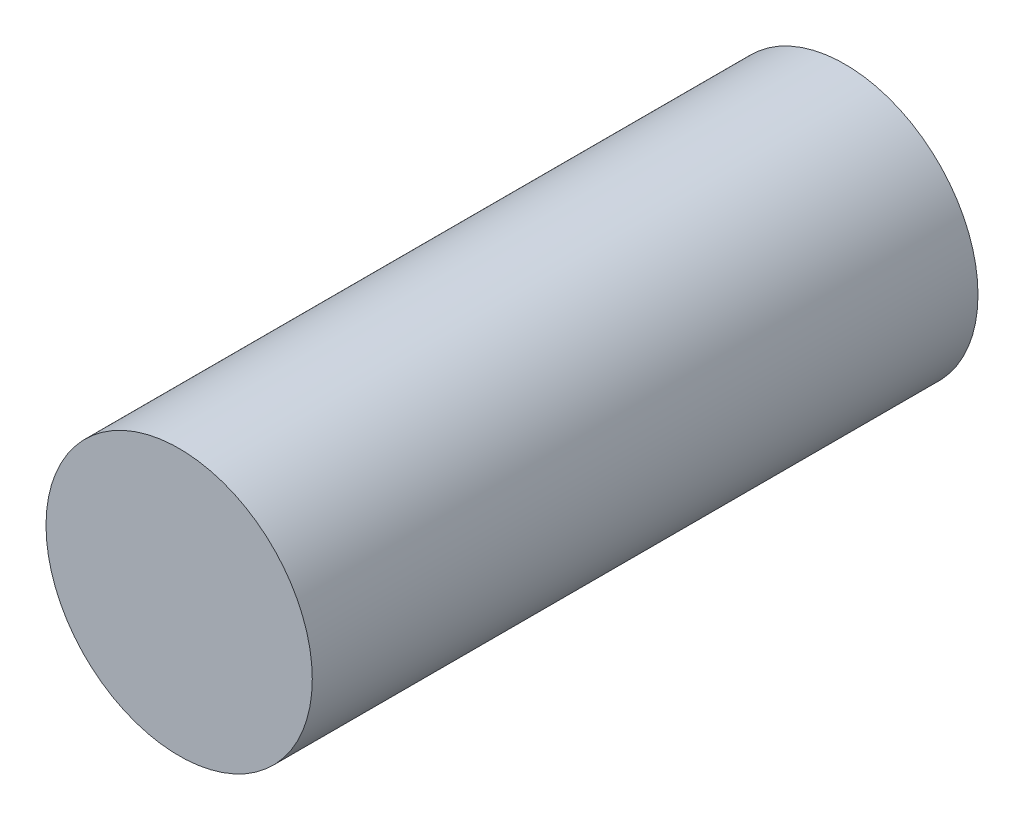
ISO-10303-21;
HEADER;
FILE_DESCRIPTION(('STEP AP214'),'2;1');
FILE_NAME('part.step','',(''),(''),'','','');
FILE_SCHEMA(('AUTOMOTIVE_DESIGN { 1 0 10303 214 1 1 1 1 }'));
ENDSEC;
DATA;
#1=APPLICATION_CONTEXT('core data for automotive mechanical design processes');
#2=APPLICATION_PROTOCOL_DEFINITION('international standard','automotive_design',2000,#1);
#3=PRODUCT_CONTEXT('',#1,'mechanical');
#4=PRODUCT('Part','Part','',(#3));
#5=PRODUCT_RELATED_PRODUCT_CATEGORY('part','',(#4));
#6=PRODUCT_DEFINITION_FORMATION('','',#4);
#7=PRODUCT_DEFINITION_CONTEXT('part definition',#1,'design');
#8=PRODUCT_DEFINITION('design','',#6,#7);
#9=PRODUCT_DEFINITION_SHAPE('','',#8);
#10=(LENGTH_UNIT() NAMED_UNIT(*) SI_UNIT(.MILLI.,.METRE.));
#11=(NAMED_UNIT(*) PLANE_ANGLE_UNIT() SI_UNIT($,.RADIAN.));
#12=(NAMED_UNIT(*) SI_UNIT($,.STERADIAN.) SOLID_ANGLE_UNIT());
#13=UNCERTAINTY_MEASURE_WITH_UNIT(LENGTH_MEASURE(1.E-05),#10,'distance_accuracy_value','');
#14=(GEOMETRIC_REPRESENTATION_CONTEXT(3) GLOBAL_UNCERTAINTY_ASSIGNED_CONTEXT((#13)) GLOBAL_UNIT_ASSIGNED_CONTEXT((#10,
#11,#12)) REPRESENTATION_CONTEXT('',''));
#15=CARTESIAN_POINT('',(0.,0.,0.));
#16=DIRECTION('',(0.,0.,1.));
#17=DIRECTION('',(1.,0.,0.));
#18=AXIS2_PLACEMENT_3D('',#15,#16,#17);
#19=CARTESIAN_POINT('',(0.,0.,150.));
#20=DIRECTION('',(0.,0.,-1.));
#21=DIRECTION('',(-1.,0.,0.));
#22=AXIS2_PLACEMENT_3D('',#19,#20,#21);
#23=CYLINDRICAL_SURFACE('',#22,30.);
#24=CARTESIAN_POINT('',(0.,0.,150.));
#25=DIRECTION('',(0.,0.,1.));
#26=DIRECTION('',(1.,0.,0.));
#27=AXIS2_PLACEMENT_3D('',#24,#25,#26);
#28=CIRCLE('',#27,30.);
#29=CARTESIAN_POINT('',(30.,0.,150.));
#30=VERTEX_POINT('',#29);
#31=EDGE_CURVE('E10',#30,#30,#28,.T.);
#32=ORIENTED_EDGE('',*,*,#31,.F.);
#33=EDGE_LOOP('',(#32));
#34=FACE_BOUND('',#33,.T.);
#35=CARTESIAN_POINT('',(0.,0.,0.));
#36=DIRECTION('',(0.,0.,1.));
#37=DIRECTION('',(1.,0.,0.));
#38=AXIS2_PLACEMENT_3D('',#35,#36,#37);
#39=CIRCLE('',#38,30.);
#40=CARTESIAN_POINT('',(30.,0.,0.));
#41=VERTEX_POINT('',#40);
#42=EDGE_CURVE('E35',#41,#41,#39,.T.);
#43=ORIENTED_EDGE('',*,*,#42,.T.);
#44=EDGE_LOOP('',(#43));
#45=FACE_BOUND('',#44,.T.);
#46=ADVANCED_FACE('F32',(#34,#45),#23,.T.);
#47=CARTESIAN_POINT('',(0.,0.,150.));
#48=DIRECTION('',(0.,0.,1.));
#49=DIRECTION('',(1.,0.,0.));
#50=AXIS2_PLACEMENT_3D('',#47,#48,#49);
#51=PLANE('',#50);
#52=ORIENTED_EDGE('',*,*,#31,.T.);
#53=EDGE_LOOP('',(#52));
#54=FACE_BOUND('',#53,.T.);
#55=ADVANCED_FACE('F47',(#54),#51,.T.);
#56=CARTESIAN_POINT('',(0.,0.,0.));
#57=DIRECTION('',(0.,0.,1.));
#58=DIRECTION('',(1.,0.,0.));
#59=AXIS2_PLACEMENT_3D('',#56,#57,#58);
#60=PLANE('',#59);
#61=ORIENTED_EDGE('',*,*,#42,.F.);
#62=EDGE_LOOP('',(#61));
#63=FACE_BOUND('',#62,.T.);
#64=ADVANCED_FACE('F45',(#63),#60,.F.);
#65=CLOSED_SHELL('',(#46,#55,#64));
#66=MANIFOLD_SOLID_BREP('B2',#65);
#67=ADVANCED_BREP_SHAPE_REPRESENTATION('',(#18,#66),#14);
#68=SHAPE_DEFINITION_REPRESENTATION(#9,#67);
ENDSEC;
END-ISO-10303-21;
